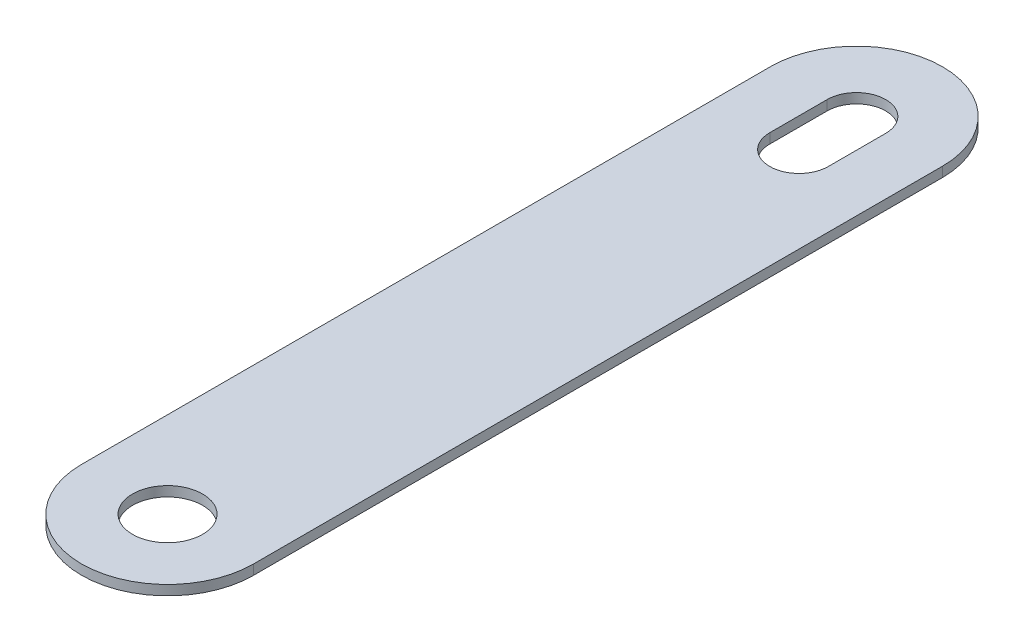
ISO-10303-21;
HEADER;
FILE_DESCRIPTION(('STEP AP214'),'2;1');
FILE_NAME('part.step','',(''),(''),'','','');
FILE_SCHEMA(('AUTOMOTIVE_DESIGN { 1 0 10303 214 1 1 1 1 }'));
ENDSEC;
DATA;
#1=APPLICATION_CONTEXT('core data for automotive mechanical design processes');
#2=APPLICATION_PROTOCOL_DEFINITION('international standard','automotive_design',2000,#1);
#3=PRODUCT_CONTEXT('',#1,'mechanical');
#4=PRODUCT('Part','Part','',(#3));
#5=PRODUCT_RELATED_PRODUCT_CATEGORY('part','',(#4));
#6=PRODUCT_DEFINITION_FORMATION('','',#4);
#7=PRODUCT_DEFINITION_CONTEXT('part definition',#1,'design');
#8=PRODUCT_DEFINITION('design','',#6,#7);
#9=PRODUCT_DEFINITION_SHAPE('','',#8);
#10=(LENGTH_UNIT() NAMED_UNIT(*) SI_UNIT(.MILLI.,.METRE.));
#11=(NAMED_UNIT(*) PLANE_ANGLE_UNIT() SI_UNIT($,.RADIAN.));
#12=(NAMED_UNIT(*) SI_UNIT($,.STERADIAN.) SOLID_ANGLE_UNIT());
#13=UNCERTAINTY_MEASURE_WITH_UNIT(LENGTH_MEASURE(1.E-05),#10,'distance_accuracy_value','');
#14=(GEOMETRIC_REPRESENTATION_CONTEXT(3) GLOBAL_UNCERTAINTY_ASSIGNED_CONTEXT((#13)) GLOBAL_UNIT_ASSIGNED_CONTEXT((#10,
#11,#12)) REPRESENTATION_CONTEXT('',''));
#15=CARTESIAN_POINT('',(0.,0.,0.));
#16=DIRECTION('',(0.,0.,1.));
#17=DIRECTION('',(1.,0.,0.));
#18=AXIS2_PLACEMENT_3D('',#15,#16,#17);
#19=CARTESIAN_POINT('',(0.,0.86,0.));
#20=DIRECTION('',(0.,1.,0.));
#21=DIRECTION('',(0.,0.,1.));
#22=AXIS2_PLACEMENT_3D('',#19,#20,#21);
#23=PLANE('',#22);
#24=CARTESIAN_POINT('',(0.,0.86,0.));
#25=DIRECTION('',(0.,1.,0.));
#26=DIRECTION('',(0.,0.,1.));
#27=AXIS2_PLACEMENT_3D('',#24,#25,#26);
#28=CIRCLE('',#27,7.5);
#29=CARTESIAN_POINT('',(-7.5,0.86,0.));
#30=VERTEX_POINT('',#29);
#31=CARTESIAN_POINT('',(7.5,0.86,0.));
#32=VERTEX_POINT('',#31);
#33=EDGE_CURVE('E140',#30,#32,#28,.T.);
#34=ORIENTED_EDGE('',*,*,#33,.T.);
#35=DIRECTION('',(0.,0.,-1.));
#36=VECTOR('',#35,1.);
#37=CARTESIAN_POINT('',(7.5,0.86,0.));
#38=LINE('',#37,#36);
#39=CARTESIAN_POINT('',(7.5,0.86,-60.));
#40=VERTEX_POINT('',#39);
#41=EDGE_CURVE('E143',#32,#40,#38,.T.);
#42=ORIENTED_EDGE('',*,*,#41,.T.);
#43=CARTESIAN_POINT('',(0.,0.86,-60.));
#44=DIRECTION('',(0.,1.,0.));
#45=DIRECTION('',(0.,0.,1.));
#46=AXIS2_PLACEMENT_3D('',#43,#44,#45);
#47=CIRCLE('',#46,7.5);
#48=CARTESIAN_POINT('',(-7.5,0.86,-60.));
#49=VERTEX_POINT('',#48);
#50=EDGE_CURVE('E146',#40,#49,#47,.T.);
#51=ORIENTED_EDGE('',*,*,#50,.T.);
#52=DIRECTION('',(0.,0.,1.));
#53=VECTOR('',#52,1.);
#54=CARTESIAN_POINT('',(-7.5,0.86,0.));
#55=LINE('',#54,#53);
#56=EDGE_CURVE('E148',#49,#30,#55,.T.);
#57=ORIENTED_EDGE('',*,*,#56,.T.);
#58=EDGE_LOOP('',(#34,#42,#51,#57));
#59=FACE_BOUND('',#58,.T.);
#60=CARTESIAN_POINT('',(0.,0.86,0.));
#61=DIRECTION('',(0.,1.,0.));
#62=DIRECTION('',(0.,0.,1.));
#63=AXIS2_PLACEMENT_3D('',#60,#61,#62);
#64=CIRCLE('',#63,3.05);
#65=CARTESIAN_POINT('',(0.,0.86,3.05));
#66=VERTEX_POINT('',#65);
#67=EDGE_CURVE('E134',#66,#66,#64,.T.);
#68=ORIENTED_EDGE('',*,*,#67,.F.);
#69=EDGE_LOOP('',(#68));
#70=FACE_BOUND('',#69,.T.);
#71=DIRECTION('',(0.,0.,1.));
#72=VECTOR('',#71,1.);
#73=CARTESIAN_POINT('',(-2.55000000000001,0.86,-60.));
#74=LINE('',#73,#72);
#75=CARTESIAN_POINT('',(-2.55000000000001,0.86,-60.));
#76=VERTEX_POINT('',#75);
#77=CARTESIAN_POINT('',(-2.55,0.86,-55.));
#78=VERTEX_POINT('',#77);
#79=EDGE_CURVE('E106',#76,#78,#74,.T.);
#80=ORIENTED_EDGE('',*,*,#79,.F.);
#81=CARTESIAN_POINT('',(0.,0.86,-60.));
#82=DIRECTION('',(0.,1.,0.));
#83=DIRECTION('',(0.,0.,1.));
#84=AXIS2_PLACEMENT_3D('',#81,#82,#83);
#85=CIRCLE('',#84,2.55000000000001);
#86=CARTESIAN_POINT('',(2.55000000000001,0.86,-60.));
#87=VERTEX_POINT('',#86);
#88=EDGE_CURVE('E98',#87,#76,#85,.T.);
#89=ORIENTED_EDGE('',*,*,#88,.F.);
#90=DIRECTION('',(0.,0.,-1.));
#91=VECTOR('',#90,1.);
#92=CARTESIAN_POINT('',(2.55000000000001,0.86,-60.));
#93=LINE('',#92,#91);
#94=CARTESIAN_POINT('',(2.55000000000001,0.86,-55.));
#95=VERTEX_POINT('',#94);
#96=EDGE_CURVE('E120',#95,#87,#93,.T.);
#97=ORIENTED_EDGE('',*,*,#96,.F.);
#98=CARTESIAN_POINT('',(0.,0.86,-55.));
#99=DIRECTION('',(0.,1.,0.));
#100=DIRECTION('',(0.,0.,1.));
#101=AXIS2_PLACEMENT_3D('',#98,#99,#100);
#102=CIRCLE('',#101,2.55000000000001);
#103=EDGE_CURVE('E118',#78,#95,#102,.T.);
#104=ORIENTED_EDGE('',*,*,#103,.F.);
#105=EDGE_LOOP('',(#80,#89,#97,#104));
#106=FACE_BOUND('',#105,.T.);
#107=ADVANCED_FACE('F33',(#59,#70,#106),#23,.T.);
#108=CARTESIAN_POINT('',(0.,0.,0.));
#109=DIRECTION('',(0.,1.,0.));
#110=DIRECTION('',(0.,0.,1.));
#111=AXIS2_PLACEMENT_3D('',#108,#109,#110);
#112=PLANE('',#111);
#113=CARTESIAN_POINT('',(0.,0.,0.));
#114=DIRECTION('',(0.,1.,0.));
#115=DIRECTION('',(0.,0.,1.));
#116=AXIS2_PLACEMENT_3D('',#113,#114,#115);
#117=CIRCLE('',#116,3.05);
#118=CARTESIAN_POINT('',(0.,0.,3.05));
#119=VERTEX_POINT('',#118);
#120=EDGE_CURVE('E114',#119,#119,#117,.T.);
#121=ORIENTED_EDGE('',*,*,#120,.T.);
#122=EDGE_LOOP('',(#121));
#123=FACE_BOUND('',#122,.T.);
#124=CARTESIAN_POINT('',(0.,0.,0.));
#125=DIRECTION('',(0.,1.,0.));
#126=DIRECTION('',(0.,0.,1.));
#127=AXIS2_PLACEMENT_3D('',#124,#125,#126);
#128=CIRCLE('',#127,7.5);
#129=CARTESIAN_POINT('',(-7.5,0.,0.));
#130=VERTEX_POINT('',#129);
#131=CARTESIAN_POINT('',(7.5,0.,0.));
#132=VERTEX_POINT('',#131);
#133=EDGE_CURVE('E137',#130,#132,#128,.T.);
#134=ORIENTED_EDGE('',*,*,#133,.F.);
#135=DIRECTION('',(0.,0.,1.));
#136=VECTOR('',#135,1.);
#137=CARTESIAN_POINT('',(-7.5,0.,0.));
#138=LINE('',#137,#136);
#139=CARTESIAN_POINT('',(-7.5,0.,-60.));
#140=VERTEX_POINT('',#139);
#141=EDGE_CURVE('E144',#140,#130,#138,.T.);
#142=ORIENTED_EDGE('',*,*,#141,.F.);
#143=CARTESIAN_POINT('',(0.,0.,-60.));
#144=DIRECTION('',(0.,1.,0.));
#145=DIRECTION('',(0.,0.,1.));
#146=AXIS2_PLACEMENT_3D('',#143,#144,#145);
#147=CIRCLE('',#146,7.5);
#148=CARTESIAN_POINT('',(7.5,0.,-60.));
#149=VERTEX_POINT('',#148);
#150=EDGE_CURVE('E155',#149,#140,#147,.T.);
#151=ORIENTED_EDGE('',*,*,#150,.F.);
#152=DIRECTION('',(0.,0.,-1.));
#153=VECTOR('',#152,1.);
#154=CARTESIAN_POINT('',(7.5,0.,0.));
#155=LINE('',#154,#153);
#156=EDGE_CURVE('E153',#132,#149,#155,.T.);
#157=ORIENTED_EDGE('',*,*,#156,.F.);
#158=EDGE_LOOP('',(#134,#142,#151,#157));
#159=FACE_BOUND('',#158,.T.);
#160=CARTESIAN_POINT('',(0.,0.,-60.));
#161=DIRECTION('',(0.,1.,0.));
#162=DIRECTION('',(0.,0.,1.));
#163=AXIS2_PLACEMENT_3D('',#160,#161,#162);
#164=CIRCLE('',#163,2.55000000000001);
#165=CARTESIAN_POINT('',(2.55000000000001,0.,-60.));
#166=VERTEX_POINT('',#165);
#167=CARTESIAN_POINT('',(-2.55000000000001,0.,-60.));
#168=VERTEX_POINT('',#167);
#169=EDGE_CURVE('E56',#166,#168,#164,.T.);
#170=ORIENTED_EDGE('',*,*,#169,.T.);
#171=DIRECTION('',(0.,0.,1.));
#172=VECTOR('',#171,1.);
#173=CARTESIAN_POINT('',(-2.55000000000001,0.,-60.));
#174=LINE('',#173,#172);
#175=CARTESIAN_POINT('',(-2.55,0.,-55.));
#176=VERTEX_POINT('',#175);
#177=EDGE_CURVE('E113',#168,#176,#174,.T.);
#178=ORIENTED_EDGE('',*,*,#177,.T.);
#179=CARTESIAN_POINT('',(0.,0.,-55.));
#180=DIRECTION('',(0.,1.,0.));
#181=DIRECTION('',(0.,0.,1.));
#182=AXIS2_PLACEMENT_3D('',#179,#180,#181);
#183=CIRCLE('',#182,2.55000000000001);
#184=CARTESIAN_POINT('',(2.55000000000001,0.,-55.));
#185=VERTEX_POINT('',#184);
#186=EDGE_CURVE('E126',#176,#185,#183,.T.);
#187=ORIENTED_EDGE('',*,*,#186,.T.);
#188=DIRECTION('',(0.,0.,-1.));
#189=VECTOR('',#188,1.);
#190=CARTESIAN_POINT('',(2.55000000000001,0.,-60.));
#191=LINE('',#190,#189);
#192=EDGE_CURVE('E107',#185,#166,#191,.T.);
#193=ORIENTED_EDGE('',*,*,#192,.T.);
#194=EDGE_LOOP('',(#170,#178,#187,#193));
#195=FACE_BOUND('',#194,.T.);
#196=ADVANCED_FACE('F173',(#123,#159,#195),#112,.F.);
#197=CARTESIAN_POINT('',(0.,0.86,0.));
#198=DIRECTION('',(0.,-1.,0.));
#199=DIRECTION('',(0.,0.,-1.));
#200=AXIS2_PLACEMENT_3D('',#197,#198,#199);
#201=CYLINDRICAL_SURFACE('',#200,7.5);
#202=ORIENTED_EDGE('',*,*,#133,.T.);
#203=DIRECTION('',(0.,-1.,0.));
#204=VECTOR('',#203,1.);
#205=CARTESIAN_POINT('',(7.5,0.86,0.));
#206=LINE('',#205,#204);
#207=EDGE_CURVE('E11',#32,#132,#206,.T.);
#208=ORIENTED_EDGE('',*,*,#207,.F.);
#209=ORIENTED_EDGE('',*,*,#33,.F.);
#210=DIRECTION('',(0.,-1.,0.));
#211=VECTOR('',#210,1.);
#212=CARTESIAN_POINT('',(-7.5,0.86,0.));
#213=LINE('',#212,#211);
#214=EDGE_CURVE('E150',#30,#130,#213,.T.);
#215=ORIENTED_EDGE('',*,*,#214,.T.);
#216=EDGE_LOOP('',(#202,#208,#209,#215));
#217=FACE_BOUND('',#216,.T.);
#218=ADVANCED_FACE('F35',(#217),#201,.T.);
#219=CARTESIAN_POINT('',(7.5,0.86,0.));
#220=DIRECTION('',(-1.,0.,0.));
#221=DIRECTION('',(0.,0.,1.));
#222=AXIS2_PLACEMENT_3D('',#219,#220,#221);
#223=PLANE('',#222);
#224=ORIENTED_EDGE('',*,*,#156,.T.);
#225=DIRECTION('',(0.,-1.,0.));
#226=VECTOR('',#225,1.);
#227=CARTESIAN_POINT('',(7.5,0.86,-60.));
#228=LINE('',#227,#226);
#229=EDGE_CURVE('E41',#40,#149,#228,.T.);
#230=ORIENTED_EDGE('',*,*,#229,.F.);
#231=ORIENTED_EDGE('',*,*,#41,.F.);
#232=ORIENTED_EDGE('',*,*,#207,.T.);
#233=EDGE_LOOP('',(#224,#230,#231,#232));
#234=FACE_BOUND('',#233,.T.);
#235=ADVANCED_FACE('F184',(#234),#223,.F.);
#236=CARTESIAN_POINT('',(0.,0.86,-60.));
#237=DIRECTION('',(0.,-1.,0.));
#238=DIRECTION('',(0.,0.,-1.));
#239=AXIS2_PLACEMENT_3D('',#236,#237,#238);
#240=CYLINDRICAL_SURFACE('',#239,7.5);
#241=ORIENTED_EDGE('',*,*,#150,.T.);
#242=DIRECTION('',(0.,-1.,0.));
#243=VECTOR('',#242,1.);
#244=CARTESIAN_POINT('',(-7.5,0.86,-60.));
#245=LINE('',#244,#243);
#246=EDGE_CURVE('E160',#49,#140,#245,.T.);
#247=ORIENTED_EDGE('',*,*,#246,.F.);
#248=ORIENTED_EDGE('',*,*,#50,.F.);
#249=ORIENTED_EDGE('',*,*,#229,.T.);
#250=EDGE_LOOP('',(#241,#247,#248,#249));
#251=FACE_BOUND('',#250,.T.);
#252=ADVANCED_FACE('F167',(#251),#240,.T.);
#253=CARTESIAN_POINT('',(-7.5,0.86,0.));
#254=DIRECTION('',(1.,0.,0.));
#255=DIRECTION('',(0.,0.,-1.));
#256=AXIS2_PLACEMENT_3D('',#253,#254,#255);
#257=PLANE('',#256);
#258=ORIENTED_EDGE('',*,*,#141,.T.);
#259=ORIENTED_EDGE('',*,*,#214,.F.);
#260=ORIENTED_EDGE('',*,*,#56,.F.);
#261=ORIENTED_EDGE('',*,*,#246,.T.);
#262=EDGE_LOOP('',(#258,#259,#260,#261));
#263=FACE_BOUND('',#262,.T.);
#264=ADVANCED_FACE('F177',(#263),#257,.F.);
#265=CARTESIAN_POINT('',(0.,0.86,0.));
#266=DIRECTION('',(0.,-1.,0.));
#267=DIRECTION('',(0.,0.,-1.));
#268=AXIS2_PLACEMENT_3D('',#265,#266,#267);
#269=CYLINDRICAL_SURFACE('',#268,3.05);
#270=ORIENTED_EDGE('',*,*,#67,.T.);
#271=EDGE_LOOP('',(#270));
#272=FACE_BOUND('',#271,.T.);
#273=ORIENTED_EDGE('',*,*,#120,.F.);
#274=EDGE_LOOP('',(#273));
#275=FACE_BOUND('',#274,.T.);
#276=ADVANCED_FACE('F199',(#272,#275),#269,.F.);
#277=CARTESIAN_POINT('',(0.,0.86,-60.));
#278=DIRECTION('',(0.,-1.,0.));
#279=DIRECTION('',(0.,0.,-1.));
#280=AXIS2_PLACEMENT_3D('',#277,#278,#279);
#281=CYLINDRICAL_SURFACE('',#280,2.55000000000001);
#282=ORIENTED_EDGE('',*,*,#169,.F.);
#283=DIRECTION('',(0.,-1.,0.));
#284=VECTOR('',#283,1.);
#285=CARTESIAN_POINT('',(2.55000000000001,0.86,-60.));
#286=LINE('',#285,#284);
#287=EDGE_CURVE('E102',#87,#166,#286,.T.);
#288=ORIENTED_EDGE('',*,*,#287,.F.);
#289=ORIENTED_EDGE('',*,*,#88,.T.);
#290=DIRECTION('',(0.,-1.,0.));
#291=VECTOR('',#290,1.);
#292=CARTESIAN_POINT('',(-2.55000000000001,0.86,-60.));
#293=LINE('',#292,#291);
#294=EDGE_CURVE('E101',#76,#168,#293,.T.);
#295=ORIENTED_EDGE('',*,*,#294,.T.);
#296=EDGE_LOOP('',(#282,#288,#289,#295));
#297=FACE_BOUND('',#296,.T.);
#298=ADVANCED_FACE('F100',(#297),#281,.F.);
#299=CARTESIAN_POINT('',(-2.55000000000001,0.86,-60.));
#300=DIRECTION('',(1.,0.,0.));
#301=DIRECTION('',(0.,0.,-1.));
#302=AXIS2_PLACEMENT_3D('',#299,#300,#301);
#303=PLANE('',#302);
#304=ORIENTED_EDGE('',*,*,#177,.F.);
#305=ORIENTED_EDGE('',*,*,#294,.F.);
#306=ORIENTED_EDGE('',*,*,#79,.T.);
#307=DIRECTION('',(0.,-1.,0.));
#308=VECTOR('',#307,1.);
#309=CARTESIAN_POINT('',(-2.55,0.86,-55.));
#310=LINE('',#309,#308);
#311=EDGE_CURVE('E115',#78,#176,#310,.T.);
#312=ORIENTED_EDGE('',*,*,#311,.T.);
#313=EDGE_LOOP('',(#304,#305,#306,#312));
#314=FACE_BOUND('',#313,.T.);
#315=ADVANCED_FACE('F110',(#314),#303,.T.);
#316=CARTESIAN_POINT('',(0.,0.86,-55.));
#317=DIRECTION('',(0.,-1.,0.));
#318=DIRECTION('',(0.,0.,-1.));
#319=AXIS2_PLACEMENT_3D('',#316,#317,#318);
#320=CYLINDRICAL_SURFACE('',#319,2.55000000000001);
#321=ORIENTED_EDGE('',*,*,#186,.F.);
#322=ORIENTED_EDGE('',*,*,#311,.F.);
#323=ORIENTED_EDGE('',*,*,#103,.T.);
#324=DIRECTION('',(0.,-1.,0.));
#325=VECTOR('',#324,1.);
#326=CARTESIAN_POINT('',(2.55000000000001,0.86,-55.));
#327=LINE('',#326,#325);
#328=EDGE_CURVE('E48',#95,#185,#327,.T.);
#329=ORIENTED_EDGE('',*,*,#328,.T.);
#330=EDGE_LOOP('',(#321,#322,#323,#329));
#331=FACE_BOUND('',#330,.T.);
#332=ADVANCED_FACE('F216',(#331),#320,.F.);
#333=CARTESIAN_POINT('',(2.55000000000001,0.86,-60.));
#334=DIRECTION('',(-1.,0.,0.));
#335=DIRECTION('',(0.,0.,1.));
#336=AXIS2_PLACEMENT_3D('',#333,#334,#335);
#337=PLANE('',#336);
#338=ORIENTED_EDGE('',*,*,#192,.F.);
#339=ORIENTED_EDGE('',*,*,#328,.F.);
#340=ORIENTED_EDGE('',*,*,#96,.T.);
#341=ORIENTED_EDGE('',*,*,#287,.T.);
#342=EDGE_LOOP('',(#338,#339,#340,#341));
#343=FACE_BOUND('',#342,.T.);
#344=ADVANCED_FACE('F221',(#343),#337,.T.);
#345=CLOSED_SHELL('',(#107,#196,#218,#235,#252,#264,#276,#298,#315,#332,#344));
#346=MANIFOLD_SOLID_BREP('B2',#345);
#347=ADVANCED_BREP_SHAPE_REPRESENTATION('',(#18,#346),#14);
#348=SHAPE_DEFINITION_REPRESENTATION(#9,#347);
ENDSEC;
END-ISO-10303-21;
